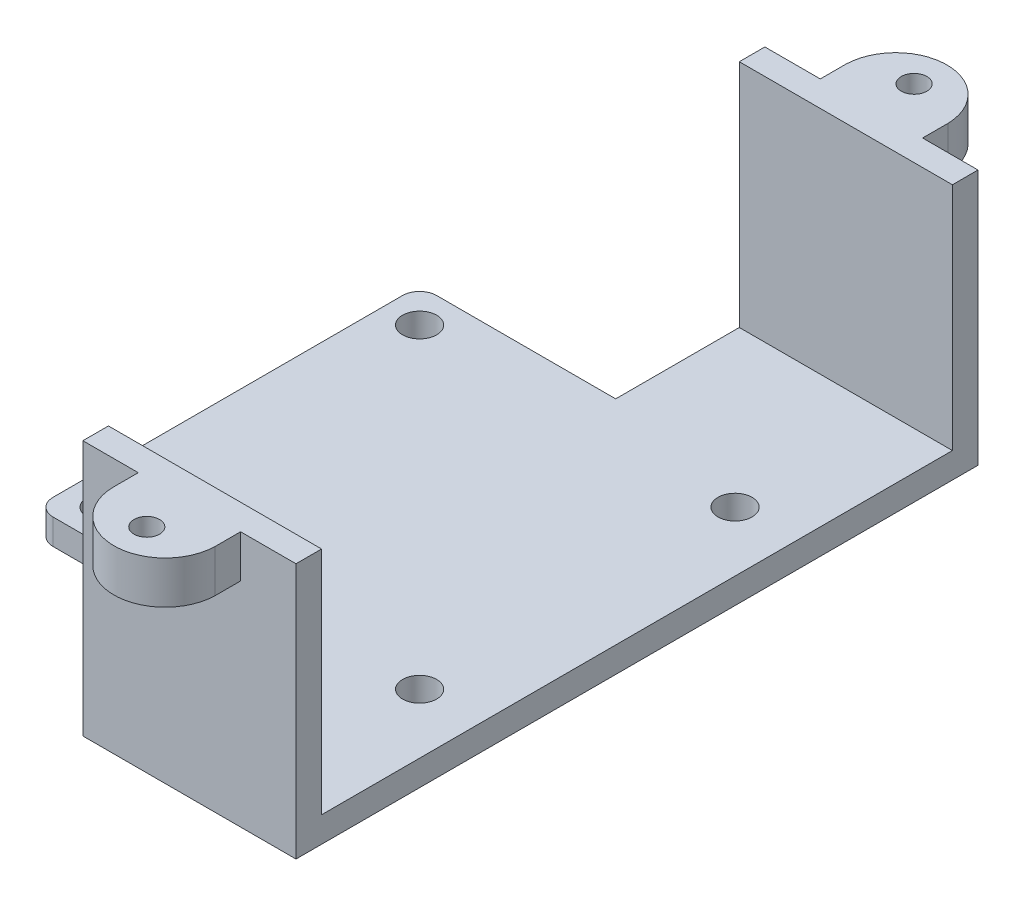
ISO-10303-21;
HEADER;
FILE_DESCRIPTION(('STEP AP214'),'2;1');
FILE_NAME('part.step','',(''),(''),'','','');
FILE_SCHEMA(('AUTOMOTIVE_DESIGN { 1 0 10303 214 1 1 1 1 }'));
ENDSEC;
DATA;
#1=APPLICATION_CONTEXT('core data for automotive mechanical design processes');
#2=APPLICATION_PROTOCOL_DEFINITION('international standard','automotive_design',2000,#1);
#3=PRODUCT_CONTEXT('',#1,'mechanical');
#4=PRODUCT('Part','Part','',(#3));
#5=PRODUCT_RELATED_PRODUCT_CATEGORY('part','',(#4));
#6=PRODUCT_DEFINITION_FORMATION('','',#4);
#7=PRODUCT_DEFINITION_CONTEXT('part definition',#1,'design');
#8=PRODUCT_DEFINITION('design','',#6,#7);
#9=PRODUCT_DEFINITION_SHAPE('','',#8);
#10=(LENGTH_UNIT() NAMED_UNIT(*) SI_UNIT(.MILLI.,.METRE.));
#11=(NAMED_UNIT(*) PLANE_ANGLE_UNIT() SI_UNIT($,.RADIAN.));
#12=(NAMED_UNIT(*) SI_UNIT($,.STERADIAN.) SOLID_ANGLE_UNIT());
#13=UNCERTAINTY_MEASURE_WITH_UNIT(LENGTH_MEASURE(1.E-05),#10,'distance_accuracy_value','');
#14=(GEOMETRIC_REPRESENTATION_CONTEXT(3) GLOBAL_UNCERTAINTY_ASSIGNED_CONTEXT((#13)) GLOBAL_UNIT_ASSIGNED_CONTEXT((#10,
#11,#12)) REPRESENTATION_CONTEXT('',''));
#15=CARTESIAN_POINT('',(0.,0.,0.));
#16=DIRECTION('',(0.,0.,1.));
#17=DIRECTION('',(1.,0.,0.));
#18=AXIS2_PLACEMENT_3D('',#15,#16,#17);
#19=CARTESIAN_POINT('',(17.2920940123323,101.641882402702,20.0847107936321));
#20=DIRECTION('',(1.,0.,0.));
#21=DIRECTION('',(0.,0.,-1.));
#22=AXIS2_PLACEMENT_3D('',#19,#20,#21);
#23=PLANE('',#22);
#24=DIRECTION('',(0.,-1.,0.));
#25=VECTOR('',#24,1.);
#26=CARTESIAN_POINT('',(17.2920940123323,104.641882402702,-42.4152892063679));
#27=LINE('',#26,#25);
#28=CARTESIAN_POINT('',(17.2920940123323,104.641882402702,-42.4152892063679));
#29=VERTEX_POINT('',#28);
#30=CARTESIAN_POINT('',(17.2920940123323,101.641882402702,-42.4152892063679));
#31=VERTEX_POINT('',#30);
#32=EDGE_CURVE('E279',#29,#31,#27,.T.);
#33=ORIENTED_EDGE('',*,*,#32,.F.);
#34=DIRECTION('',(0.,0.,-1.));
#35=VECTOR('',#34,1.);
#36=CARTESIAN_POINT('',(17.2920940123323,104.641882402702,20.0847107936321));
#37=LINE('',#36,#35);
#38=CARTESIAN_POINT('',(17.2920940123323,104.641882402702,-56.9152892063679));
#39=VERTEX_POINT('',#38);
#40=EDGE_CURVE('E55',#29,#39,#37,.T.);
#41=ORIENTED_EDGE('',*,*,#40,.T.);
#42=DIRECTION('',(0.,1.,0.));
#43=VECTOR('',#42,1.);
#44=CARTESIAN_POINT('',(17.2920940123323,101.641882402702,-56.9152892063679));
#45=LINE('',#44,#43);
#46=CARTESIAN_POINT('',(17.2920940123323,131.641882402702,-56.9152892063679));
#47=VERTEX_POINT('',#46);
#48=EDGE_CURVE('E224',#39,#47,#45,.T.);
#49=ORIENTED_EDGE('',*,*,#48,.T.);
#50=DIRECTION('',(0.,0.,-1.));
#51=VECTOR('',#50,1.);
#52=CARTESIAN_POINT('',(17.2920940123323,131.641882402702,20.0847107936321));
#53=LINE('',#52,#51);
#54=CARTESIAN_POINT('',(17.2920940123323,131.641882402702,-59.9152892063679));
#55=VERTEX_POINT('',#54);
#56=EDGE_CURVE('E253',#47,#55,#53,.T.);
#57=ORIENTED_EDGE('',*,*,#56,.T.);
#58=DIRECTION('',(0.,1.,0.));
#59=VECTOR('',#58,1.);
#60=CARTESIAN_POINT('',(17.2920940123323,101.641882402702,-59.9152892063679));
#61=LINE('',#60,#59);
#62=CARTESIAN_POINT('',(17.2920940123323,101.641882402702,-59.9152892063679));
#63=VERTEX_POINT('',#62);
#64=EDGE_CURVE('E260',#63,#55,#61,.T.);
#65=ORIENTED_EDGE('',*,*,#64,.F.);
#66=DIRECTION('',(0.,0.,-1.));
#67=VECTOR('',#66,1.);
#68=CARTESIAN_POINT('',(17.2920940123323,101.641882402702,20.0847107936321));
#69=LINE('',#68,#67);
#70=EDGE_CURVE('E240',#31,#63,#69,.T.);
#71=ORIENTED_EDGE('',*,*,#70,.F.);
#72=EDGE_LOOP('',(#33,#41,#49,#57,#65,#71));
#73=FACE_BOUND('',#72,.T.);
#74=ADVANCED_FACE('F47',(#73),#23,.F.);
#75=CARTESIAN_POINT('',(17.2920940123323,101.641882402702,-59.9152892063679));
#76=DIRECTION('',(0.,0.,1.));
#77=DIRECTION('',(1.,0.,0.));
#78=AXIS2_PLACEMENT_3D('',#75,#76,#77);
#79=PLANE('',#78);
#80=DIRECTION('',(0.,1.,0.));
#81=VECTOR('',#80,1.);
#82=CARTESIAN_POINT('',(23.7920940123323,126.641882402702,-59.9152892063679));
#83=LINE('',#82,#81);
#84=CARTESIAN_POINT('',(23.7920940123323,126.641882402702,-59.9152892063679));
#85=VERTEX_POINT('',#84);
#86=CARTESIAN_POINT('',(23.7920940123323,131.641882402702,-59.9152892063679));
#87=VERTEX_POINT('',#86);
#88=EDGE_CURVE('E334',#85,#87,#83,.T.);
#89=ORIENTED_EDGE('',*,*,#88,.F.);
#90=DIRECTION('',(-1.,0.,0.));
#91=VECTOR('',#90,1.);
#92=CARTESIAN_POINT('',(23.7920940123323,126.641882402702,-59.9152892063679));
#93=LINE('',#92,#91);
#94=CARTESIAN_POINT('',(35.7920940123323,126.641882402702,-59.9152892063679));
#95=VERTEX_POINT('',#94);
#96=EDGE_CURVE('E349',#95,#85,#93,.T.);
#97=ORIENTED_EDGE('',*,*,#96,.F.);
#98=DIRECTION('',(0.,1.,0.));
#99=VECTOR('',#98,1.);
#100=CARTESIAN_POINT('',(35.7920940123323,126.641882402702,-59.9152892063679));
#101=LINE('',#100,#99);
#102=CARTESIAN_POINT('',(35.7920940123323,131.641882402702,-59.9152892063679));
#103=VERTEX_POINT('',#102);
#104=EDGE_CURVE('E332',#95,#103,#101,.T.);
#105=ORIENTED_EDGE('',*,*,#104,.T.);
#106=DIRECTION('',(1.,0.,0.));
#107=VECTOR('',#106,1.);
#108=CARTESIAN_POINT('',(17.2920940123323,131.641882402702,-59.9152892063679));
#109=LINE('',#108,#107);
#110=CARTESIAN_POINT('',(42.2920940123323,131.641882402702,-59.9152892063679));
#111=VERTEX_POINT('',#110);
#112=EDGE_CURVE('E255',#103,#111,#109,.T.);
#113=ORIENTED_EDGE('',*,*,#112,.T.);
#114=DIRECTION('',(0.,1.,0.));
#115=VECTOR('',#114,1.);
#116=CARTESIAN_POINT('',(42.2920940123323,101.641882402702,-59.9152892063679));
#117=LINE('',#116,#115);
#118=CARTESIAN_POINT('',(42.2920940123323,101.641882402702,-59.9152892063679));
#119=VERTEX_POINT('',#118);
#120=EDGE_CURVE('E245',#119,#111,#117,.T.);
#121=ORIENTED_EDGE('',*,*,#120,.F.);
#122=DIRECTION('',(1.,0.,0.));
#123=VECTOR('',#122,1.);
#124=CARTESIAN_POINT('',(17.2920940123323,101.641882402702,-59.9152892063679));
#125=LINE('',#124,#123);
#126=EDGE_CURVE('E243',#63,#119,#125,.T.);
#127=ORIENTED_EDGE('',*,*,#126,.F.);
#128=ORIENTED_EDGE('',*,*,#64,.T.);
#129=EDGE_CURVE('E238',#55,#87,#109,.T.);
#130=ORIENTED_EDGE('',*,*,#129,.T.);
#131=EDGE_LOOP('',(#89,#97,#105,#113,#121,#127,#128,#130));
#132=FACE_BOUND('',#131,.T.);
#133=ADVANCED_FACE('F452',(#132),#79,.F.);
#134=CARTESIAN_POINT('',(17.2920940123323,101.641882402702,20.0847107936321));
#135=DIRECTION('',(0.,0.,-1.));
#136=DIRECTION('',(-1.,0.,0.));
#137=AXIS2_PLACEMENT_3D('',#134,#135,#136);
#138=PLANE('',#137);
#139=DIRECTION('',(0.,1.,0.));
#140=VECTOR('',#139,1.);
#141=CARTESIAN_POINT('',(35.7920940123323,126.641882402702,20.0847107936321));
#142=LINE('',#141,#140);
#143=CARTESIAN_POINT('',(35.7920940123323,126.641882402702,20.0847107936321));
#144=VERTEX_POINT('',#143);
#145=CARTESIAN_POINT('',(35.7920940123323,131.641882402702,20.0847107936321));
#146=VERTEX_POINT('',#145);
#147=EDGE_CURVE('E303',#144,#146,#142,.T.);
#148=ORIENTED_EDGE('',*,*,#147,.F.);
#149=DIRECTION('',(1.,0.,0.));
#150=VECTOR('',#149,1.);
#151=CARTESIAN_POINT('',(23.7920940123323,126.641882402702,20.0847107936321));
#152=LINE('',#151,#150);
#153=CARTESIAN_POINT('',(23.7920940123323,126.641882402702,20.0847107936321));
#154=VERTEX_POINT('',#153);
#155=EDGE_CURVE('E319',#154,#144,#152,.T.);
#156=ORIENTED_EDGE('',*,*,#155,.F.);
#157=DIRECTION('',(0.,1.,0.));
#158=VECTOR('',#157,1.);
#159=CARTESIAN_POINT('',(23.7920940123323,126.641882402702,20.0847107936321));
#160=LINE('',#159,#158);
#161=CARTESIAN_POINT('',(23.7920940123323,131.641882402702,20.0847107936321));
#162=VERTEX_POINT('',#161);
#163=EDGE_CURVE('E298',#154,#162,#160,.T.);
#164=ORIENTED_EDGE('',*,*,#163,.T.);
#165=DIRECTION('',(-1.,0.,0.));
#166=VECTOR('',#165,1.);
#167=CARTESIAN_POINT('',(17.2920940123323,131.641882402702,20.0847107936321));
#168=LINE('',#167,#166);
#169=CARTESIAN_POINT('',(17.2920940123323,131.641882402702,20.0847107936321));
#170=VERTEX_POINT('',#169);
#171=EDGE_CURVE('E249',#162,#170,#168,.T.);
#172=ORIENTED_EDGE('',*,*,#171,.T.);
#173=DIRECTION('',(0.,1.,0.));
#174=VECTOR('',#173,1.);
#175=CARTESIAN_POINT('',(17.2920940123323,101.641882402702,20.0847107936321));
#176=LINE('',#175,#174);
#177=CARTESIAN_POINT('',(17.2920940123323,101.641882402702,20.0847107936321));
#178=VERTEX_POINT('',#177);
#179=EDGE_CURVE('E263',#178,#170,#176,.T.);
#180=ORIENTED_EDGE('',*,*,#179,.F.);
#181=DIRECTION('',(-1.,0.,0.));
#182=VECTOR('',#181,1.);
#183=CARTESIAN_POINT('',(17.2920940123323,101.641882402702,20.0847107936321));
#184=LINE('',#183,#182);
#185=CARTESIAN_POINT('',(42.2920940123323,101.641882402702,20.0847107936321));
#186=VERTEX_POINT('',#185);
#187=EDGE_CURVE('E237',#186,#178,#184,.T.);
#188=ORIENTED_EDGE('',*,*,#187,.F.);
#189=DIRECTION('',(0.,1.,0.));
#190=VECTOR('',#189,1.);
#191=CARTESIAN_POINT('',(42.2920940123323,101.641882402702,20.0847107936321));
#192=LINE('',#191,#190);
#193=CARTESIAN_POINT('',(42.2920940123323,131.641882402702,20.0847107936321));
#194=VERTEX_POINT('',#193);
#195=EDGE_CURVE('E265',#186,#194,#192,.T.);
#196=ORIENTED_EDGE('',*,*,#195,.T.);
#197=EDGE_CURVE('E250',#194,#146,#168,.T.);
#198=ORIENTED_EDGE('',*,*,#197,.T.);
#199=EDGE_LOOP('',(#148,#156,#164,#172,#180,#188,#196,#198));
#200=FACE_BOUND('',#199,.T.);
#201=ADVANCED_FACE('F457',(#200),#138,.F.);
#202=CARTESIAN_POINT('',(0.,131.641882402702,0.));
#203=DIRECTION('',(0.,-1.,0.));
#204=DIRECTION('',(0.,0.,-1.));
#205=AXIS2_PLACEMENT_3D('',#202,#203,#204);
#206=PLANE('',#205);
#207=ORIENTED_EDGE('',*,*,#56,.F.);
#208=DIRECTION('',(1.,0.,0.));
#209=VECTOR('',#208,1.);
#210=CARTESIAN_POINT('',(0.,131.641882402702,-56.9152892063679));
#211=LINE('',#210,#209);
#212=CARTESIAN_POINT('',(42.2920940123323,131.641882402702,-56.9152892063679));
#213=VERTEX_POINT('',#212);
#214=EDGE_CURVE('E269',#47,#213,#211,.T.);
#215=ORIENTED_EDGE('',*,*,#214,.T.);
#216=DIRECTION('',(0.,0.,1.));
#217=VECTOR('',#216,1.);
#218=CARTESIAN_POINT('',(42.2920940123323,131.641882402702,20.0847107936321));
#219=LINE('',#218,#217);
#220=EDGE_CURVE('E246',#111,#213,#219,.T.);
#221=ORIENTED_EDGE('',*,*,#220,.F.);
#222=ORIENTED_EDGE('',*,*,#112,.F.);
#223=DIRECTION('',(0.,0.,1.));
#224=VECTOR('',#223,1.);
#225=CARTESIAN_POINT('',(35.7920940123323,131.641882402702,-62.9152892063679));
#226=LINE('',#225,#224);
#227=CARTESIAN_POINT('',(35.7920940123323,131.641882402702,-62.9152892063679));
#228=VERTEX_POINT('',#227);
#229=EDGE_CURVE('E70',#228,#103,#226,.T.);
#230=ORIENTED_EDGE('',*,*,#229,.F.);
#231=CARTESIAN_POINT('',(29.7920940123323,131.641882402702,-62.7672489979093));
#232=DIRECTION('',(0.,-1.,0.));
#233=DIRECTION('',(0.,0.,-1.));
#234=AXIS2_PLACEMENT_3D('',#231,#232,#233);
#235=CIRCLE('',#234,6.00182604740595);
#236=CARTESIAN_POINT('',(23.7920940123323,131.641882402702,-62.9152892063679));
#237=VERTEX_POINT('',#236);
#238=EDGE_CURVE('E344',#237,#228,#235,.T.);
#239=ORIENTED_EDGE('',*,*,#238,.F.);
#240=DIRECTION('',(0.,0.,-1.));
#241=VECTOR('',#240,1.);
#242=CARTESIAN_POINT('',(23.7920940123323,131.641882402702,-62.9152892063679));
#243=LINE('',#242,#241);
#244=EDGE_CURVE('E340',#87,#237,#243,.T.);
#245=ORIENTED_EDGE('',*,*,#244,.F.);
#246=ORIENTED_EDGE('',*,*,#129,.F.);
#247=EDGE_LOOP('',(#207,#215,#221,#222,#230,#239,#245,#246));
#248=FACE_BOUND('',#247,.T.);
#249=CARTESIAN_POINT('',(29.7920940123323,131.641882402702,-64.9152892063679));
#250=DIRECTION('',(0.,-1.,0.));
#251=DIRECTION('',(0.,0.,1.));
#252=AXIS2_PLACEMENT_3D('',#249,#250,#251);
#253=CIRCLE('',#252,1.49999999999999);
#254=CARTESIAN_POINT('',(29.7920940123323,131.641882402702,-63.4152892063679));
#255=VERTEX_POINT('',#254);
#256=EDGE_CURVE('E355',#255,#255,#253,.T.);
#257=ORIENTED_EDGE('',*,*,#256,.T.);
#258=EDGE_LOOP('',(#257));
#259=FACE_BOUND('',#258,.T.);
#260=ADVANCED_FACE('F464',(#248,#259),#206,.F.);
#261=CARTESIAN_POINT('',(42.2920940123323,101.641882402702,20.0847107936321));
#262=DIRECTION('',(-1.,0.,0.));
#263=DIRECTION('',(0.,0.,1.));
#264=AXIS2_PLACEMENT_3D('',#261,#262,#263);
#265=PLANE('',#264);
#266=ORIENTED_EDGE('',*,*,#220,.T.);
#267=DIRECTION('',(0.,1.,0.));
#268=VECTOR('',#267,1.);
#269=CARTESIAN_POINT('',(42.2920940123323,131.641882402702,-56.9152892063679));
#270=LINE('',#269,#268);
#271=CARTESIAN_POINT('',(42.2920940123323,104.641882402702,-56.9152892063679));
#272=VERTEX_POINT('',#271);
#273=EDGE_CURVE('E293',#272,#213,#270,.T.);
#274=ORIENTED_EDGE('',*,*,#273,.F.);
#275=DIRECTION('',(0.,0.,-1.));
#276=VECTOR('',#275,1.);
#277=CARTESIAN_POINT('',(42.2920940123323,104.641882402702,-56.9152892063679));
#278=LINE('',#277,#276);
#279=CARTESIAN_POINT('',(42.2920940123323,104.641882402702,17.0847107936321));
#280=VERTEX_POINT('',#279);
#281=EDGE_CURVE('E286',#280,#272,#278,.T.);
#282=ORIENTED_EDGE('',*,*,#281,.F.);
#283=DIRECTION('',(0.,-1.,0.));
#284=VECTOR('',#283,1.);
#285=CARTESIAN_POINT('',(42.2920940123323,131.641882402702,17.0847107936321));
#286=LINE('',#285,#284);
#287=CARTESIAN_POINT('',(42.2920940123323,131.641882402702,17.0847107936321));
#288=VERTEX_POINT('',#287);
#289=EDGE_CURVE('E291',#288,#280,#286,.T.);
#290=ORIENTED_EDGE('',*,*,#289,.F.);
#291=EDGE_CURVE('E228',#288,#194,#219,.T.);
#292=ORIENTED_EDGE('',*,*,#291,.T.);
#293=ORIENTED_EDGE('',*,*,#195,.F.);
#294=DIRECTION('',(0.,0.,1.));
#295=VECTOR('',#294,1.);
#296=CARTESIAN_POINT('',(42.2920940123323,101.641882402702,20.0847107936321));
#297=LINE('',#296,#295);
#298=EDGE_CURVE('E234',#119,#186,#297,.T.);
#299=ORIENTED_EDGE('',*,*,#298,.F.);
#300=ORIENTED_EDGE('',*,*,#120,.T.);
#301=EDGE_LOOP('',(#266,#274,#282,#290,#292,#293,#299,#300));
#302=FACE_BOUND('',#301,.T.);
#303=ADVANCED_FACE('F49',(#302),#265,.F.);
#304=CARTESIAN_POINT('',(17.2920940123323,104.641882402702,17.0847107936321));
#305=VERTEX_POINT('',#304);
#306=CARTESIAN_POINT('',(17.2920940123323,104.641882402702,2.5847107936321));
#307=VERTEX_POINT('',#306);
#308=EDGE_CURVE('E12',#305,#307,#37,.T.);
#309=ORIENTED_EDGE('',*,*,#308,.T.);
#310=DIRECTION('',(0.,-1.,0.));
#311=VECTOR('',#310,1.);
#312=CARTESIAN_POINT('',(17.2920940123323,104.641882402702,2.5847107936321));
#313=LINE('',#312,#311);
#314=CARTESIAN_POINT('',(17.2920940123323,101.641882402702,2.5847107936321));
#315=VERTEX_POINT('',#314);
#316=EDGE_CURVE('E195',#307,#315,#313,.T.);
#317=ORIENTED_EDGE('',*,*,#316,.T.);
#318=EDGE_CURVE('E241',#178,#315,#69,.T.);
#319=ORIENTED_EDGE('',*,*,#318,.F.);
#320=ORIENTED_EDGE('',*,*,#179,.T.);
#321=CARTESIAN_POINT('',(17.2920940123323,131.641882402702,17.0847107936321));
#322=VERTEX_POINT('',#321);
#323=EDGE_CURVE('E221',#170,#322,#53,.T.);
#324=ORIENTED_EDGE('',*,*,#323,.T.);
#325=DIRECTION('',(0.,-1.,0.));
#326=VECTOR('',#325,1.);
#327=CARTESIAN_POINT('',(17.2920940123323,101.641882402702,17.0847107936321));
#328=LINE('',#327,#326);
#329=EDGE_CURVE('E218',#322,#305,#328,.T.);
#330=ORIENTED_EDGE('',*,*,#329,.T.);
#331=EDGE_LOOP('',(#309,#317,#319,#320,#324,#330));
#332=FACE_BOUND('',#331,.T.);
#333=ADVANCED_FACE('F216',(#332),#23,.F.);
#334=CARTESIAN_POINT('',(0.,101.641882402702,0.));
#335=DIRECTION('',(0.,-1.,0.));
#336=DIRECTION('',(0.,0.,-1.));
#337=AXIS2_PLACEMENT_3D('',#334,#335,#336);
#338=PLANE('',#337);
#339=CARTESIAN_POINT('',(35.2920940123323,101.641882402702,-1.41528920636792));
#340=DIRECTION('',(0.,-1.,0.));
#341=DIRECTION('',(0.,0.,-1.));
#342=AXIS2_PLACEMENT_3D('',#339,#340,#341);
#343=CIRCLE('',#342,2.);
#344=CARTESIAN_POINT('',(35.2920940123323,101.641882402702,-3.41528920636792));
#345=VERTEX_POINT('',#344);
#346=EDGE_CURVE('E407',#345,#345,#343,.T.);
#347=ORIENTED_EDGE('',*,*,#346,.F.);
#348=EDGE_LOOP('',(#347));
#349=FACE_BOUND('',#348,.T.);
#350=CARTESIAN_POINT('',(35.2920940123323,101.641882402702,-38.4152892063679));
#351=DIRECTION('',(0.,-1.,0.));
#352=DIRECTION('',(0.,0.,-1.));
#353=AXIS2_PLACEMENT_3D('',#350,#351,#352);
#354=CIRCLE('',#353,2.);
#355=CARTESIAN_POINT('',(35.2920940123323,101.641882402702,-40.4152892063679));
#356=VERTEX_POINT('',#355);
#357=EDGE_CURVE('E401',#356,#356,#354,.T.);
#358=ORIENTED_EDGE('',*,*,#357,.F.);
#359=EDGE_LOOP('',(#358));
#360=FACE_BOUND('',#359,.T.);
#361=ORIENTED_EDGE('',*,*,#298,.T.);
#362=ORIENTED_EDGE('',*,*,#187,.T.);
#363=ORIENTED_EDGE('',*,*,#318,.T.);
#364=DIRECTION('',(-1.,0.,0.));
#365=VECTOR('',#364,1.);
#366=CARTESIAN_POINT('',(17.2920940123323,101.641882402702,2.5847107936321));
#367=LINE('',#366,#365);
#368=CARTESIAN_POINT('',(-3.70790598766771,101.641882402702,2.58471079363209));
#369=VERTEX_POINT('',#368);
#370=EDGE_CURVE('E62',#315,#369,#367,.T.);
#371=ORIENTED_EDGE('',*,*,#370,.T.);
#372=CARTESIAN_POINT('',(-3.7079059876677,101.641882402702,0.584710793632086));
#373=DIRECTION('',(0.,-1.,0.));
#374=DIRECTION('',(0.,0.,-1.));
#375=AXIS2_PLACEMENT_3D('',#372,#373,#374);
#376=CIRCLE('',#375,2.);
#377=CARTESIAN_POINT('',(-5.70790598766771,101.641882402702,0.584710793632086));
#378=VERTEX_POINT('',#377);
#379=EDGE_CURVE('E376',#369,#378,#376,.T.);
#380=ORIENTED_EDGE('',*,*,#379,.T.);
#381=DIRECTION('',(0.,0.,-1.));
#382=VECTOR('',#381,1.);
#383=CARTESIAN_POINT('',(-5.7079059876677,101.641882402702,0.584710793632085));
#384=LINE('',#383,#382);
#385=CARTESIAN_POINT('',(-5.70790598766769,101.641882402702,-40.4152892063679));
#386=VERTEX_POINT('',#385);
#387=EDGE_CURVE('E373',#378,#386,#384,.T.);
#388=ORIENTED_EDGE('',*,*,#387,.T.);
#389=CARTESIAN_POINT('',(-3.70790598766769,101.641882402702,-40.4152892063679));
#390=DIRECTION('',(0.,-1.,0.));
#391=DIRECTION('',(0.,0.,1.));
#392=AXIS2_PLACEMENT_3D('',#389,#390,#391);
#393=CIRCLE('',#392,2.);
#394=CARTESIAN_POINT('',(-3.70790598766769,101.641882402702,-42.4152892063679));
#395=VERTEX_POINT('',#394);
#396=EDGE_CURVE('E370',#386,#395,#393,.T.);
#397=ORIENTED_EDGE('',*,*,#396,.T.);
#398=DIRECTION('',(1.,0.,0.));
#399=VECTOR('',#398,1.);
#400=CARTESIAN_POINT('',(17.2920940123323,101.641882402702,-42.4152892063679));
#401=LINE('',#400,#399);
#402=EDGE_CURVE('E213',#395,#31,#401,.T.);
#403=ORIENTED_EDGE('',*,*,#402,.T.);
#404=ORIENTED_EDGE('',*,*,#70,.T.);
#405=ORIENTED_EDGE('',*,*,#126,.T.);
#406=EDGE_LOOP('',(#361,#362,#363,#371,#380,#388,#397,#403,#404,#405));
#407=FACE_BOUND('',#406,.T.);
#408=CARTESIAN_POINT('',(-1.70790598766769,101.641882402702,-1.41528920636792));
#409=DIRECTION('',(0.,-1.,0.));
#410=DIRECTION('',(0.,0.,-1.));
#411=AXIS2_PLACEMENT_3D('',#408,#409,#410);
#412=CIRCLE('',#411,2.);
#413=CARTESIAN_POINT('',(-1.70790598766769,101.641882402702,-3.41528920636792));
#414=VERTEX_POINT('',#413);
#415=EDGE_CURVE('E395',#414,#414,#412,.T.);
#416=ORIENTED_EDGE('',*,*,#415,.F.);
#417=EDGE_LOOP('',(#416));
#418=FACE_BOUND('',#417,.T.);
#419=CARTESIAN_POINT('',(-1.70790598766769,101.641882402702,-38.4152892063679));
#420=DIRECTION('',(0.,-1.,0.));
#421=DIRECTION('',(0.,0.,-1.));
#422=AXIS2_PLACEMENT_3D('',#419,#420,#421);
#423=CIRCLE('',#422,2.);
#424=CARTESIAN_POINT('',(-1.70790598766769,101.641882402702,-40.4152892063679));
#425=VERTEX_POINT('',#424);
#426=EDGE_CURVE('E389',#425,#425,#423,.T.);
#427=ORIENTED_EDGE('',*,*,#426,.F.);
#428=EDGE_LOOP('',(#427));
#429=FACE_BOUND('',#428,.T.);
#430=ADVANCED_FACE('F422',(#349,#360,#407,#418,#429),#338,.T.);
#431=ORIENTED_EDGE('',*,*,#291,.F.);
#432=DIRECTION('',(-1.,0.,0.));
#433=VECTOR('',#432,1.);
#434=CARTESIAN_POINT('',(0.,131.641882402702,17.0847107936321));
#435=LINE('',#434,#433);
#436=EDGE_CURVE('E268',#288,#322,#435,.T.);
#437=ORIENTED_EDGE('',*,*,#436,.T.);
#438=ORIENTED_EDGE('',*,*,#323,.F.);
#439=ORIENTED_EDGE('',*,*,#171,.F.);
#440=DIRECTION('',(0.,0.,-1.));
#441=VECTOR('',#440,1.);
#442=CARTESIAN_POINT('',(23.7920940123323,131.641882402702,23.0847107936321));
#443=LINE('',#442,#441);
#444=CARTESIAN_POINT('',(23.7920940123323,131.641882402702,23.0847107936321));
#445=VERTEX_POINT('',#444);
#446=EDGE_CURVE('E312',#445,#162,#443,.T.);
#447=ORIENTED_EDGE('',*,*,#446,.F.);
#448=CARTESIAN_POINT('',(29.7920940123323,131.641882402702,22.9366705851734));
#449=DIRECTION('',(0.,-1.,0.));
#450=DIRECTION('',(0.,0.,1.));
#451=AXIS2_PLACEMENT_3D('',#448,#449,#450);
#452=CIRCLE('',#451,6.00182604740595);
#453=CARTESIAN_POINT('',(35.7920940123323,131.641882402702,23.0847107936321));
#454=VERTEX_POINT('',#453);
#455=EDGE_CURVE('E314',#454,#445,#452,.T.);
#456=ORIENTED_EDGE('',*,*,#455,.F.);
#457=DIRECTION('',(0.,0.,1.));
#458=VECTOR('',#457,1.);
#459=CARTESIAN_POINT('',(35.7920940123323,131.641882402702,23.0847107936321));
#460=LINE('',#459,#458);
#461=EDGE_CURVE('E309',#146,#454,#460,.T.);
#462=ORIENTED_EDGE('',*,*,#461,.F.);
#463=ORIENTED_EDGE('',*,*,#197,.F.);
#464=EDGE_LOOP('',(#431,#437,#438,#439,#447,#456,#462,#463));
#465=FACE_BOUND('',#464,.T.);
#466=CARTESIAN_POINT('',(29.7920940123323,131.641882402702,25.0847107936321));
#467=DIRECTION('',(0.,-1.,0.));
#468=DIRECTION('',(0.,0.,-1.));
#469=AXIS2_PLACEMENT_3D('',#466,#467,#468);
#470=CIRCLE('',#469,1.5);
#471=CARTESIAN_POINT('',(29.7920940123323,131.641882402702,23.5847107936321));
#472=VERTEX_POINT('',#471);
#473=EDGE_CURVE('E325',#472,#472,#470,.T.);
#474=ORIENTED_EDGE('',*,*,#473,.T.);
#475=EDGE_LOOP('',(#474));
#476=FACE_BOUND('',#475,.T.);
#477=ADVANCED_FACE('F425',(#465,#476),#206,.F.);
#478=CARTESIAN_POINT('',(9.29209401233231,104.641882402702,-56.9152892063679));
#479=DIRECTION('',(0.,-1.,0.));
#480=DIRECTION('',(0.,0.,-1.));
#481=AXIS2_PLACEMENT_3D('',#478,#479,#480);
#482=PLANE('',#481);
#483=CARTESIAN_POINT('',(35.2920940123323,104.641882402702,-1.41528920636792));
#484=DIRECTION('',(0.,-1.,0.));
#485=DIRECTION('',(0.,0.,-1.));
#486=AXIS2_PLACEMENT_3D('',#483,#484,#485);
#487=CIRCLE('',#486,2.);
#488=CARTESIAN_POINT('',(35.2920940123323,104.641882402702,-3.41528920636792));
#489=VERTEX_POINT('',#488);
#490=EDGE_CURVE('E398',#489,#489,#487,.T.);
#491=ORIENTED_EDGE('',*,*,#490,.T.);
#492=EDGE_LOOP('',(#491));
#493=FACE_BOUND('',#492,.T.);
#494=CARTESIAN_POINT('',(35.2920940123323,104.641882402702,-38.4152892063679));
#495=DIRECTION('',(0.,-1.,0.));
#496=DIRECTION('',(0.,0.,-1.));
#497=AXIS2_PLACEMENT_3D('',#494,#495,#496);
#498=CIRCLE('',#497,2.);
#499=CARTESIAN_POINT('',(35.2920940123323,104.641882402702,-40.4152892063679));
#500=VERTEX_POINT('',#499);
#501=EDGE_CURVE('E404',#500,#500,#498,.T.);
#502=ORIENTED_EDGE('',*,*,#501,.T.);
#503=EDGE_LOOP('',(#502));
#504=FACE_BOUND('',#503,.T.);
#505=DIRECTION('',(1.,0.,0.));
#506=VECTOR('',#505,1.);
#507=CARTESIAN_POINT('',(9.2920940123323,104.641882402702,17.0847107936321));
#508=LINE('',#507,#506);
#509=EDGE_CURVE('E230',#305,#280,#508,.T.);
#510=ORIENTED_EDGE('',*,*,#509,.T.);
#511=ORIENTED_EDGE('',*,*,#281,.T.);
#512=DIRECTION('',(1.,0.,0.));
#513=VECTOR('',#512,1.);
#514=CARTESIAN_POINT('',(9.29209401233231,104.641882402702,-56.9152892063679));
#515=LINE('',#514,#513);
#516=EDGE_CURVE('E225',#39,#272,#515,.T.);
#517=ORIENTED_EDGE('',*,*,#516,.F.);
#518=ORIENTED_EDGE('',*,*,#40,.F.);
#519=DIRECTION('',(1.,0.,0.));
#520=VECTOR('',#519,1.);
#521=CARTESIAN_POINT('',(17.2920940123323,104.641882402702,-42.4152892063679));
#522=LINE('',#521,#520);
#523=CARTESIAN_POINT('',(-3.70790598766769,104.641882402702,-42.4152892063679));
#524=VERTEX_POINT('',#523);
#525=EDGE_CURVE('E203',#524,#29,#522,.T.);
#526=ORIENTED_EDGE('',*,*,#525,.F.);
#527=CARTESIAN_POINT('',(-3.70790598766769,104.641882402702,-40.4152892063679));
#528=DIRECTION('',(0.,-1.,0.));
#529=DIRECTION('',(0.,0.,1.));
#530=AXIS2_PLACEMENT_3D('',#527,#528,#529);
#531=CIRCLE('',#530,2.);
#532=CARTESIAN_POINT('',(-5.70790598766769,104.641882402702,-40.4152892063679));
#533=VERTEX_POINT('',#532);
#534=EDGE_CURVE('E382',#533,#524,#531,.T.);
#535=ORIENTED_EDGE('',*,*,#534,.F.);
#536=DIRECTION('',(0.,0.,-1.));
#537=VECTOR('',#536,1.);
#538=CARTESIAN_POINT('',(-5.7079059876677,104.641882402702,0.584710793632085));
#539=LINE('',#538,#537);
#540=CARTESIAN_POINT('',(-5.70790598766771,104.641882402702,0.584710793632086));
#541=VERTEX_POINT('',#540);
#542=EDGE_CURVE('E385',#541,#533,#539,.T.);
#543=ORIENTED_EDGE('',*,*,#542,.F.);
#544=CARTESIAN_POINT('',(-3.7079059876677,104.641882402702,0.584710793632086));
#545=DIRECTION('',(0.,-1.,0.));
#546=DIRECTION('',(0.,0.,-1.));
#547=AXIS2_PLACEMENT_3D('',#544,#545,#546);
#548=CIRCLE('',#547,2.);
#549=CARTESIAN_POINT('',(-3.70790598766771,104.641882402702,2.58471079363209));
#550=VERTEX_POINT('',#549);
#551=EDGE_CURVE('E212',#550,#541,#548,.T.);
#552=ORIENTED_EDGE('',*,*,#551,.F.);
#553=DIRECTION('',(-1.,0.,0.));
#554=VECTOR('',#553,1.);
#555=CARTESIAN_POINT('',(17.2920940123323,104.641882402702,2.5847107936321));
#556=LINE('',#555,#554);
#557=EDGE_CURVE('E198',#307,#550,#556,.T.);
#558=ORIENTED_EDGE('',*,*,#557,.F.);
#559=ORIENTED_EDGE('',*,*,#308,.F.);
#560=EDGE_LOOP('',(#510,#511,#517,#518,#526,#535,#543,#552,#558,#559));
#561=FACE_BOUND('',#560,.T.);
#562=CARTESIAN_POINT('',(-1.70790598766769,104.641882402702,-1.41528920636792));
#563=DIRECTION('',(0.,-1.,0.));
#564=DIRECTION('',(0.,0.,-1.));
#565=AXIS2_PLACEMENT_3D('',#562,#563,#564);
#566=CIRCLE('',#565,2.);
#567=CARTESIAN_POINT('',(-1.70790598766769,104.641882402702,-3.41528920636792));
#568=VERTEX_POINT('',#567);
#569=EDGE_CURVE('E392',#568,#568,#566,.T.);
#570=ORIENTED_EDGE('',*,*,#569,.T.);
#571=EDGE_LOOP('',(#570));
#572=FACE_BOUND('',#571,.T.);
#573=CARTESIAN_POINT('',(-1.70790598766769,104.641882402702,-38.4152892063679));
#574=DIRECTION('',(0.,-1.,0.));
#575=DIRECTION('',(0.,0.,-1.));
#576=AXIS2_PLACEMENT_3D('',#573,#574,#575);
#577=CIRCLE('',#576,2.);
#578=CARTESIAN_POINT('',(-1.70790598766769,104.641882402702,-40.4152892063679));
#579=VERTEX_POINT('',#578);
#580=EDGE_CURVE('E380',#579,#579,#577,.T.);
#581=ORIENTED_EDGE('',*,*,#580,.T.);
#582=EDGE_LOOP('',(#581));
#583=FACE_BOUND('',#582,.T.);
#584=ADVANCED_FACE('F207',(#493,#504,#561,#572,#583),#482,.F.);
#585=CARTESIAN_POINT('',(9.29209401233231,131.641882402702,-56.9152892063679));
#586=DIRECTION('',(0.,0.,-1.));
#587=DIRECTION('',(0.,1.,0.));
#588=AXIS2_PLACEMENT_3D('',#585,#586,#587);
#589=PLANE('',#588);
#590=ORIENTED_EDGE('',*,*,#516,.T.);
#591=ORIENTED_EDGE('',*,*,#273,.T.);
#592=ORIENTED_EDGE('',*,*,#214,.F.);
#593=ORIENTED_EDGE('',*,*,#48,.F.);
#594=EDGE_LOOP('',(#590,#591,#592,#593));
#595=FACE_BOUND('',#594,.T.);
#596=ADVANCED_FACE('F283',(#595),#589,.F.);
#597=CARTESIAN_POINT('',(9.2920940123323,131.641882402702,17.0847107936321));
#598=DIRECTION('',(0.,0.,1.));
#599=DIRECTION('',(1.,0.,0.));
#600=AXIS2_PLACEMENT_3D('',#597,#598,#599);
#601=PLANE('',#600);
#602=ORIENTED_EDGE('',*,*,#436,.F.);
#603=ORIENTED_EDGE('',*,*,#289,.T.);
#604=ORIENTED_EDGE('',*,*,#509,.F.);
#605=ORIENTED_EDGE('',*,*,#329,.F.);
#606=EDGE_LOOP('',(#602,#603,#604,#605));
#607=FACE_BOUND('',#606,.T.);
#608=ADVANCED_FACE('F507',(#607),#601,.F.);
#609=CARTESIAN_POINT('',(29.7920940123323,126.641882402702,22.9366705851734));
#610=DIRECTION('',(0.,1.,0.));
#611=DIRECTION('',(0.,0.,1.));
#612=AXIS2_PLACEMENT_3D('',#609,#610,#611);
#613=PLANE('',#612);
#614=CARTESIAN_POINT('',(29.7920940123323,126.641882402702,22.9366705851734));
#615=DIRECTION('',(0.,-1.,0.));
#616=DIRECTION('',(0.,0.,1.));
#617=AXIS2_PLACEMENT_3D('',#614,#615,#616);
#618=CIRCLE('',#617,6.00182604740595);
#619=CARTESIAN_POINT('',(35.7920940123323,126.641882402702,23.0847107936321));
#620=VERTEX_POINT('',#619);
#621=CARTESIAN_POINT('',(23.7920940123323,126.641882402702,23.0847107936321));
#622=VERTEX_POINT('',#621);
#623=EDGE_CURVE('E311',#620,#622,#618,.T.);
#624=ORIENTED_EDGE('',*,*,#623,.T.);
#625=DIRECTION('',(0.,0.,-1.));
#626=VECTOR('',#625,1.);
#627=CARTESIAN_POINT('',(23.7920940123323,126.641882402702,23.0847107936321));
#628=LINE('',#627,#626);
#629=EDGE_CURVE('E321',#622,#154,#628,.T.);
#630=ORIENTED_EDGE('',*,*,#629,.T.);
#631=ORIENTED_EDGE('',*,*,#155,.T.);
#632=DIRECTION('',(0.,0.,1.));
#633=VECTOR('',#632,1.);
#634=CARTESIAN_POINT('',(35.7920940123323,126.641882402702,23.0847107936321));
#635=LINE('',#634,#633);
#636=EDGE_CURVE('E308',#144,#620,#635,.T.);
#637=ORIENTED_EDGE('',*,*,#636,.T.);
#638=EDGE_LOOP('',(#624,#630,#631,#637));
#639=FACE_BOUND('',#638,.T.);
#640=CARTESIAN_POINT('',(29.7920940123323,126.641882402702,25.0847107936321));
#641=DIRECTION('',(0.,-1.,0.));
#642=DIRECTION('',(0.,0.,-1.));
#643=AXIS2_PLACEMENT_3D('',#640,#641,#642);
#644=CIRCLE('',#643,1.5);
#645=CARTESIAN_POINT('',(29.7920940123323,126.641882402702,23.5847107936321));
#646=VERTEX_POINT('',#645);
#647=EDGE_CURVE('E317',#646,#646,#644,.T.);
#648=ORIENTED_EDGE('',*,*,#647,.F.);
#649=EDGE_LOOP('',(#648));
#650=FACE_BOUND('',#649,.T.);
#651=ADVANCED_FACE('F504',(#639,#650),#613,.F.);
#652=CARTESIAN_POINT('',(29.7920940123323,126.641882402702,22.9366705851734));
#653=DIRECTION('',(0.,1.,0.));
#654=DIRECTION('',(0.,0.,1.));
#655=AXIS2_PLACEMENT_3D('',#652,#653,#654);
#656=CYLINDRICAL_SURFACE('',#655,6.00182604740595);
#657=ORIENTED_EDGE('',*,*,#455,.T.);
#658=DIRECTION('',(0.,1.,0.));
#659=VECTOR('',#658,1.);
#660=CARTESIAN_POINT('',(23.7920940123323,126.641882402702,23.0847107936321));
#661=LINE('',#660,#659);
#662=EDGE_CURVE('E294',#622,#445,#661,.T.);
#663=ORIENTED_EDGE('',*,*,#662,.F.);
#664=ORIENTED_EDGE('',*,*,#623,.F.);
#665=DIRECTION('',(0.,1.,0.));
#666=VECTOR('',#665,1.);
#667=CARTESIAN_POINT('',(35.7920940123323,126.641882402702,23.0847107936321));
#668=LINE('',#667,#666);
#669=EDGE_CURVE('E305',#620,#454,#668,.T.);
#670=ORIENTED_EDGE('',*,*,#669,.T.);
#671=EDGE_LOOP('',(#657,#663,#664,#670));
#672=FACE_BOUND('',#671,.T.);
#673=ADVANCED_FACE('F506',(#672),#656,.T.);
#674=CARTESIAN_POINT('',(23.7920940123323,126.641882402702,23.0847107936321));
#675=DIRECTION('',(1.,0.,0.));
#676=DIRECTION('',(0.,0.,-1.));
#677=AXIS2_PLACEMENT_3D('',#674,#675,#676);
#678=PLANE('',#677);
#679=ORIENTED_EDGE('',*,*,#446,.T.);
#680=ORIENTED_EDGE('',*,*,#163,.F.);
#681=ORIENTED_EDGE('',*,*,#629,.F.);
#682=ORIENTED_EDGE('',*,*,#662,.T.);
#683=EDGE_LOOP('',(#679,#680,#681,#682));
#684=FACE_BOUND('',#683,.T.);
#685=ADVANCED_FACE('F498',(#684),#678,.F.);
#686=CARTESIAN_POINT('',(35.7920940123323,126.641882402702,23.0847107936321));
#687=DIRECTION('',(-1.,0.,0.));
#688=DIRECTION('',(0.,0.,1.));
#689=AXIS2_PLACEMENT_3D('',#686,#687,#688);
#690=PLANE('',#689);
#691=ORIENTED_EDGE('',*,*,#461,.T.);
#692=ORIENTED_EDGE('',*,*,#669,.F.);
#693=ORIENTED_EDGE('',*,*,#636,.F.);
#694=ORIENTED_EDGE('',*,*,#147,.T.);
#695=EDGE_LOOP('',(#691,#692,#693,#694));
#696=FACE_BOUND('',#695,.T.);
#697=ADVANCED_FACE('F488',(#696),#690,.F.);
#698=CARTESIAN_POINT('',(29.7920940123323,126.641882402702,25.0847107936321));
#699=DIRECTION('',(0.,1.,0.));
#700=DIRECTION('',(0.,0.,1.));
#701=AXIS2_PLACEMENT_3D('',#698,#699,#700);
#702=CYLINDRICAL_SURFACE('',#701,1.5);
#703=ORIENTED_EDGE('',*,*,#647,.T.);
#704=EDGE_LOOP('',(#703));
#705=FACE_BOUND('',#704,.T.);
#706=ORIENTED_EDGE('',*,*,#473,.F.);
#707=EDGE_LOOP('',(#706));
#708=FACE_BOUND('',#707,.T.);
#709=ADVANCED_FACE('F485',(#705,#708),#702,.F.);
#710=CARTESIAN_POINT('',(29.7920940123323,126.641882402702,-62.7672489979093));
#711=DIRECTION('',(0.,-1.,0.));
#712=DIRECTION('',(0.,0.,-1.));
#713=AXIS2_PLACEMENT_3D('',#710,#711,#712);
#714=PLANE('',#713);
#715=CARTESIAN_POINT('',(29.7920940123323,126.641882402702,-62.7672489979093));
#716=DIRECTION('',(0.,-1.,0.));
#717=DIRECTION('',(0.,0.,-1.));
#718=AXIS2_PLACEMENT_3D('',#715,#716,#717);
#719=CIRCLE('',#718,6.00182604740595);
#720=CARTESIAN_POINT('',(23.7920940123323,126.641882402702,-62.9152892063679));
#721=VERTEX_POINT('',#720);
#722=CARTESIAN_POINT('',(35.7920940123323,126.641882402702,-62.9152892063679));
#723=VERTEX_POINT('',#722);
#724=EDGE_CURVE('E342',#721,#723,#719,.T.);
#725=ORIENTED_EDGE('',*,*,#724,.T.);
#726=DIRECTION('',(0.,0.,1.));
#727=VECTOR('',#726,1.);
#728=CARTESIAN_POINT('',(35.7920940123323,126.641882402702,-62.9152892063679));
#729=LINE('',#728,#727);
#730=EDGE_CURVE('E351',#723,#95,#729,.T.);
#731=ORIENTED_EDGE('',*,*,#730,.T.);
#732=ORIENTED_EDGE('',*,*,#96,.T.);
#733=DIRECTION('',(0.,0.,-1.));
#734=VECTOR('',#733,1.);
#735=CARTESIAN_POINT('',(23.7920940123323,126.641882402702,-62.9152892063679));
#736=LINE('',#735,#734);
#737=EDGE_CURVE('E339',#85,#721,#736,.T.);
#738=ORIENTED_EDGE('',*,*,#737,.T.);
#739=EDGE_LOOP('',(#725,#731,#732,#738));
#740=FACE_BOUND('',#739,.T.);
#741=CARTESIAN_POINT('',(29.7920940123323,126.641882402702,-64.9152892063679));
#742=DIRECTION('',(0.,-1.,0.));
#743=DIRECTION('',(0.,0.,1.));
#744=AXIS2_PLACEMENT_3D('',#741,#742,#743);
#745=CIRCLE('',#744,1.49999999999999);
#746=CARTESIAN_POINT('',(29.7920940123323,126.641882402702,-63.4152892063679));
#747=VERTEX_POINT('',#746);
#748=EDGE_CURVE('E347',#747,#747,#745,.T.);
#749=ORIENTED_EDGE('',*,*,#748,.F.);
#750=EDGE_LOOP('',(#749));
#751=FACE_BOUND('',#750,.T.);
#752=ADVANCED_FACE('F487',(#740,#751),#714,.T.);
#753=CARTESIAN_POINT('',(29.7920940123323,126.641882402702,-62.7672489979093));
#754=DIRECTION('',(0.,1.,0.));
#755=DIRECTION('',(0.,0.,1.));
#756=AXIS2_PLACEMENT_3D('',#753,#754,#755);
#757=CYLINDRICAL_SURFACE('',#756,6.00182604740595);
#758=ORIENTED_EDGE('',*,*,#238,.T.);
#759=DIRECTION('',(0.,1.,0.));
#760=VECTOR('',#759,1.);
#761=CARTESIAN_POINT('',(35.7920940123323,126.641882402702,-62.9152892063679));
#762=LINE('',#761,#760);
#763=EDGE_CURVE('E328',#723,#228,#762,.T.);
#764=ORIENTED_EDGE('',*,*,#763,.F.);
#765=ORIENTED_EDGE('',*,*,#724,.F.);
#766=DIRECTION('',(0.,1.,0.));
#767=VECTOR('',#766,1.);
#768=CARTESIAN_POINT('',(23.7920940123323,126.641882402702,-62.9152892063679));
#769=LINE('',#768,#767);
#770=EDGE_CURVE('E336',#721,#237,#769,.T.);
#771=ORIENTED_EDGE('',*,*,#770,.T.);
#772=EDGE_LOOP('',(#758,#764,#765,#771));
#773=FACE_BOUND('',#772,.T.);
#774=ADVANCED_FACE('F495',(#773),#757,.T.);
#775=CARTESIAN_POINT('',(35.7920940123323,126.641882402702,-62.9152892063679));
#776=DIRECTION('',(-1.,0.,0.));
#777=DIRECTION('',(0.,0.,1.));
#778=AXIS2_PLACEMENT_3D('',#775,#776,#777);
#779=PLANE('',#778);
#780=ORIENTED_EDGE('',*,*,#229,.T.);
#781=ORIENTED_EDGE('',*,*,#104,.F.);
#782=ORIENTED_EDGE('',*,*,#730,.F.);
#783=ORIENTED_EDGE('',*,*,#763,.T.);
#784=EDGE_LOOP('',(#780,#781,#782,#783));
#785=FACE_BOUND('',#784,.T.);
#786=ADVANCED_FACE('F563',(#785),#779,.F.);
#787=CARTESIAN_POINT('',(23.7920940123323,126.641882402702,-62.9152892063679));
#788=DIRECTION('',(1.,0.,0.));
#789=DIRECTION('',(0.,0.,-1.));
#790=AXIS2_PLACEMENT_3D('',#787,#788,#789);
#791=PLANE('',#790);
#792=ORIENTED_EDGE('',*,*,#244,.T.);
#793=ORIENTED_EDGE('',*,*,#770,.F.);
#794=ORIENTED_EDGE('',*,*,#737,.F.);
#795=ORIENTED_EDGE('',*,*,#88,.T.);
#796=EDGE_LOOP('',(#792,#793,#794,#795));
#797=FACE_BOUND('',#796,.T.);
#798=ADVANCED_FACE('F572',(#797),#791,.F.);
#799=CARTESIAN_POINT('',(29.7920940123323,126.641882402702,-64.9152892063679));
#800=DIRECTION('',(0.,1.,0.));
#801=DIRECTION('',(0.,0.,1.));
#802=AXIS2_PLACEMENT_3D('',#799,#800,#801);
#803=CYLINDRICAL_SURFACE('',#802,1.49999999999999);
#804=ORIENTED_EDGE('',*,*,#748,.T.);
#805=EDGE_LOOP('',(#804));
#806=FACE_BOUND('',#805,.T.);
#807=ORIENTED_EDGE('',*,*,#256,.F.);
#808=EDGE_LOOP('',(#807));
#809=FACE_BOUND('',#808,.T.);
#810=ADVANCED_FACE('F580',(#806,#809),#803,.F.);
#811=CARTESIAN_POINT('',(17.2920940123323,104.641882402702,-42.4152892063679));
#812=DIRECTION('',(0.,0.,-1.));
#813=DIRECTION('',(-1.,0.,0.));
#814=AXIS2_PLACEMENT_3D('',#811,#812,#813);
#815=PLANE('',#814);
#816=ORIENTED_EDGE('',*,*,#402,.F.);
#817=DIRECTION('',(0.,-1.,0.));
#818=VECTOR('',#817,1.);
#819=CARTESIAN_POINT('',(-3.70790598766769,104.641882402702,-42.4152892063679));
#820=LINE('',#819,#818);
#821=EDGE_CURVE('E365',#524,#395,#820,.T.);
#822=ORIENTED_EDGE('',*,*,#821,.F.);
#823=ORIENTED_EDGE('',*,*,#525,.T.);
#824=ORIENTED_EDGE('',*,*,#32,.T.);
#825=EDGE_LOOP('',(#816,#822,#823,#824));
#826=FACE_BOUND('',#825,.T.);
#827=ADVANCED_FACE('F589',(#826),#815,.T.);
#828=CARTESIAN_POINT('',(-3.70790598766769,104.641882402702,-40.4152892063679));
#829=DIRECTION('',(0.,-1.,0.));
#830=DIRECTION('',(0.,0.,-1.));
#831=AXIS2_PLACEMENT_3D('',#828,#829,#830);
#832=CYLINDRICAL_SURFACE('',#831,2.);
#833=ORIENTED_EDGE('',*,*,#396,.F.);
#834=DIRECTION('',(0.,-1.,0.));
#835=VECTOR('',#834,1.);
#836=CARTESIAN_POINT('',(-5.70790598766769,104.641882402702,-40.4152892063679));
#837=LINE('',#836,#835);
#838=EDGE_CURVE('E363',#533,#386,#837,.T.);
#839=ORIENTED_EDGE('',*,*,#838,.F.);
#840=ORIENTED_EDGE('',*,*,#534,.T.);
#841=ORIENTED_EDGE('',*,*,#821,.T.);
#842=EDGE_LOOP('',(#833,#839,#840,#841));
#843=FACE_BOUND('',#842,.T.);
#844=ADVANCED_FACE('F611',(#843),#832,.T.);
#845=CARTESIAN_POINT('',(-5.7079059876677,104.641882402702,0.584710793632085));
#846=DIRECTION('',(-1.,0.,0.));
#847=DIRECTION('',(0.,0.,1.));
#848=AXIS2_PLACEMENT_3D('',#845,#846,#847);
#849=PLANE('',#848);
#850=ORIENTED_EDGE('',*,*,#387,.F.);
#851=DIRECTION('',(0.,-1.,0.));
#852=VECTOR('',#851,1.);
#853=CARTESIAN_POINT('',(-5.70790598766771,104.641882402702,0.584710793632086));
#854=LINE('',#853,#852);
#855=EDGE_CURVE('E361',#541,#378,#854,.T.);
#856=ORIENTED_EDGE('',*,*,#855,.F.);
#857=ORIENTED_EDGE('',*,*,#542,.T.);
#858=ORIENTED_EDGE('',*,*,#838,.T.);
#859=EDGE_LOOP('',(#850,#856,#857,#858));
#860=FACE_BOUND('',#859,.T.);
#861=ADVANCED_FACE('F621',(#860),#849,.T.);
#862=CARTESIAN_POINT('',(-3.7079059876677,104.641882402702,0.584710793632086));
#863=DIRECTION('',(0.,-1.,0.));
#864=DIRECTION('',(0.,0.,-1.));
#865=AXIS2_PLACEMENT_3D('',#862,#863,#864);
#866=CYLINDRICAL_SURFACE('',#865,2.);
#867=ORIENTED_EDGE('',*,*,#379,.F.);
#868=DIRECTION('',(0.,-1.,0.));
#869=VECTOR('',#868,1.);
#870=CARTESIAN_POINT('',(-3.70790598766771,104.641882402702,2.58471079363209));
#871=LINE('',#870,#869);
#872=EDGE_CURVE('E202',#550,#369,#871,.T.);
#873=ORIENTED_EDGE('',*,*,#872,.F.);
#874=ORIENTED_EDGE('',*,*,#551,.T.);
#875=ORIENTED_EDGE('',*,*,#855,.T.);
#876=EDGE_LOOP('',(#867,#873,#874,#875));
#877=FACE_BOUND('',#876,.T.);
#878=ADVANCED_FACE('F447',(#877),#866,.T.);
#879=CARTESIAN_POINT('',(17.2920940123323,104.641882402702,2.5847107936321));
#880=DIRECTION('',(0.,0.,1.));
#881=DIRECTION('',(1.,0.,0.));
#882=AXIS2_PLACEMENT_3D('',#879,#880,#881);
#883=PLANE('',#882);
#884=ORIENTED_EDGE('',*,*,#370,.F.);
#885=ORIENTED_EDGE('',*,*,#316,.F.);
#886=ORIENTED_EDGE('',*,*,#557,.T.);
#887=ORIENTED_EDGE('',*,*,#872,.T.);
#888=EDGE_LOOP('',(#884,#885,#886,#887));
#889=FACE_BOUND('',#888,.T.);
#890=ADVANCED_FACE('F197',(#889),#883,.T.);
#891=CARTESIAN_POINT('',(-1.70790598766769,104.641882402702,-38.4152892063679));
#892=DIRECTION('',(0.,-1.,0.));
#893=DIRECTION('',(0.,0.,-1.));
#894=AXIS2_PLACEMENT_3D('',#891,#892,#893);
#895=CYLINDRICAL_SURFACE('',#894,2.);
#896=ORIENTED_EDGE('',*,*,#580,.F.);
#897=EDGE_LOOP('',(#896));
#898=FACE_BOUND('',#897,.T.);
#899=ORIENTED_EDGE('',*,*,#426,.T.);
#900=EDGE_LOOP('',(#899));
#901=FACE_BOUND('',#900,.T.);
#902=ADVANCED_FACE('F436',(#898,#901),#895,.F.);
#903=CARTESIAN_POINT('',(-1.70790598766769,104.641882402702,-1.41528920636792));
#904=DIRECTION('',(0.,-1.,0.));
#905=DIRECTION('',(0.,0.,-1.));
#906=AXIS2_PLACEMENT_3D('',#903,#904,#905);
#907=CYLINDRICAL_SURFACE('',#906,2.);
#908=ORIENTED_EDGE('',*,*,#569,.F.);
#909=EDGE_LOOP('',(#908));
#910=FACE_BOUND('',#909,.T.);
#911=ORIENTED_EDGE('',*,*,#415,.T.);
#912=EDGE_LOOP('',(#911));
#913=FACE_BOUND('',#912,.T.);
#914=ADVANCED_FACE('F438',(#910,#913),#907,.F.);
#915=CARTESIAN_POINT('',(35.2920940123323,104.641882402702,-38.4152892063679));
#916=DIRECTION('',(0.,-1.,0.));
#917=DIRECTION('',(0.,0.,-1.));
#918=AXIS2_PLACEMENT_3D('',#915,#916,#917);
#919=CYLINDRICAL_SURFACE('',#918,2.);
#920=ORIENTED_EDGE('',*,*,#501,.F.);
#921=EDGE_LOOP('',(#920));
#922=FACE_BOUND('',#921,.T.);
#923=ORIENTED_EDGE('',*,*,#357,.T.);
#924=EDGE_LOOP('',(#923));
#925=FACE_BOUND('',#924,.T.);
#926=ADVANCED_FACE('F418',(#922,#925),#919,.F.);
#927=CARTESIAN_POINT('',(35.2920940123323,104.641882402702,-1.41528920636792));
#928=DIRECTION('',(0.,-1.,0.));
#929=DIRECTION('',(0.,0.,-1.));
#930=AXIS2_PLACEMENT_3D('',#927,#928,#929);
#931=CYLINDRICAL_SURFACE('',#930,2.);
#932=ORIENTED_EDGE('',*,*,#490,.F.);
#933=EDGE_LOOP('',(#932));
#934=FACE_BOUND('',#933,.T.);
#935=ORIENTED_EDGE('',*,*,#346,.T.);
#936=EDGE_LOOP('',(#935));
#937=FACE_BOUND('',#936,.T.);
#938=ADVANCED_FACE('F415',(#934,#937),#931,.F.);
#939=CLOSED_SHELL('',(#74,#133,#201,#260,#303,#333,#430,#477,#584,#596,#608,#651,#673,#685,#697,
#709,#752,#774,#786,#798,#810,#827,#844,#861,#878,#890,#902,#914,#926,#938));
#940=MANIFOLD_SOLID_BREP('B2',#939);
#941=ADVANCED_BREP_SHAPE_REPRESENTATION('',(#18,#940),#14);
#942=SHAPE_DEFINITION_REPRESENTATION(#9,#941);
ENDSEC;
END-ISO-10303-21;
